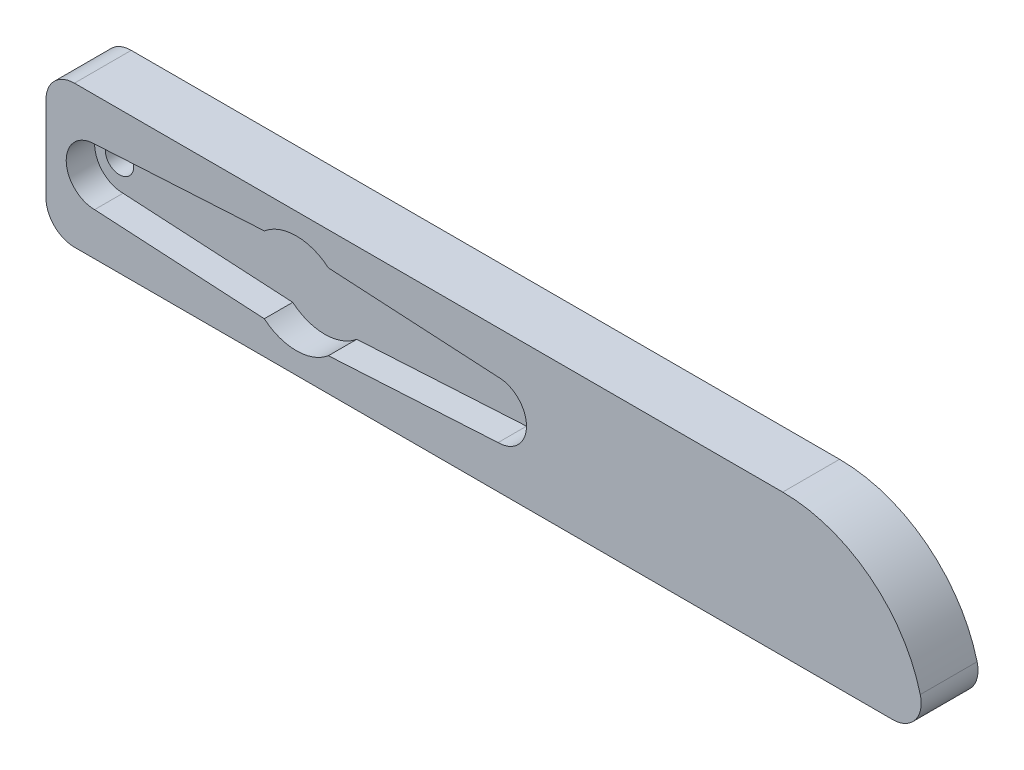
ISO-10303-21;
HEADER;
FILE_DESCRIPTION(('STEP AP214'),'2;1');
FILE_NAME('part.step','',(''),(''),'','','');
FILE_SCHEMA(('AUTOMOTIVE_DESIGN { 1 0 10303 214 1 1 1 1 }'));
ENDSEC;
DATA;
#1=APPLICATION_CONTEXT('core data for automotive mechanical design processes');
#2=APPLICATION_PROTOCOL_DEFINITION('international standard','automotive_design',2000,#1);
#3=PRODUCT_CONTEXT('',#1,'mechanical');
#4=PRODUCT('Part','Part','',(#3));
#5=PRODUCT_RELATED_PRODUCT_CATEGORY('part','',(#4));
#6=PRODUCT_DEFINITION_FORMATION('','',#4);
#7=PRODUCT_DEFINITION_CONTEXT('part definition',#1,'design');
#8=PRODUCT_DEFINITION('design','',#6,#7);
#9=PRODUCT_DEFINITION_SHAPE('','',#8);
#10=(LENGTH_UNIT() NAMED_UNIT(*) SI_UNIT(.MILLI.,.METRE.));
#11=(NAMED_UNIT(*) PLANE_ANGLE_UNIT() SI_UNIT($,.RADIAN.));
#12=(NAMED_UNIT(*) SI_UNIT($,.STERADIAN.) SOLID_ANGLE_UNIT());
#13=UNCERTAINTY_MEASURE_WITH_UNIT(LENGTH_MEASURE(1.E-05),#10,'distance_accuracy_value','');
#14=(GEOMETRIC_REPRESENTATION_CONTEXT(3) GLOBAL_UNCERTAINTY_ASSIGNED_CONTEXT((#13)) GLOBAL_UNIT_ASSIGNED_CONTEXT((#10,
#11,#12)) REPRESENTATION_CONTEXT('',''));
#15=CARTESIAN_POINT('',(0.,0.,0.));
#16=DIRECTION('',(0.,0.,1.));
#17=DIRECTION('',(1.,0.,0.));
#18=AXIS2_PLACEMENT_3D('',#15,#16,#17);
#19=CARTESIAN_POINT('',(-25.,5.,4.));
#20=DIRECTION('',(0.,-1.,0.));
#21=DIRECTION('',(0.,0.,-1.));
#22=AXIS2_PLACEMENT_3D('',#19,#20,#21);
#23=PLANE('',#22);
#24=DIRECTION('',(-1.,0.,0.));
#25=VECTOR('',#24,1.);
#26=CARTESIAN_POINT('',(-25.,5.,0.));
#27=LINE('',#26,#25);
#28=CARTESIAN_POINT('',(34.2351663750844,5.,0.));
#29=VERTEX_POINT('',#28);
#30=CARTESIAN_POINT('',(-15.6215575444172,5.,0.));
#31=VERTEX_POINT('',#30);
#32=EDGE_CURVE('E205',#29,#31,#27,.T.);
#33=ORIENTED_EDGE('',*,*,#32,.T.);
#34=DIRECTION('',(0.,0.,-1.));
#35=VECTOR('',#34,1.);
#36=CARTESIAN_POINT('',(-15.6215575444172,5.,4.));
#37=LINE('',#36,#35);
#38=CARTESIAN_POINT('',(-15.6215575444172,5.,4.));
#39=VERTEX_POINT('',#38);
#40=EDGE_CURVE('E248',#31,#39,#37,.F.);
#41=ORIENTED_EDGE('',*,*,#40,.T.);
#42=DIRECTION('',(-1.,0.,0.));
#43=VECTOR('',#42,1.);
#44=CARTESIAN_POINT('',(-25.,5.,4.));
#45=LINE('',#44,#43);
#46=CARTESIAN_POINT('',(34.2351663750844,5.,4.));
#47=VERTEX_POINT('',#46);
#48=EDGE_CURVE('E217',#47,#39,#45,.T.);
#49=ORIENTED_EDGE('',*,*,#48,.F.);
#50=DIRECTION('',(0.,0.,1.));
#51=VECTOR('',#50,1.);
#52=CARTESIAN_POINT('',(34.2351663750844,5.,0.));
#53=LINE('',#52,#51);
#54=EDGE_CURVE('E228',#47,#29,#53,.F.);
#55=ORIENTED_EDGE('',*,*,#54,.T.);
#56=EDGE_LOOP('',(#33,#41,#49,#55));
#57=FACE_BOUND('',#56,.T.);
#58=ADVANCED_FACE('F33',(#57),#23,.F.);
#59=CARTESIAN_POINT('',(-25.,-5.,4.));
#60=DIRECTION('',(0.,1.,0.));
#61=DIRECTION('',(0.,0.,1.));
#62=AXIS2_PLACEMENT_3D('',#59,#60,#61);
#63=PLANE('',#62);
#64=DIRECTION('',(1.,0.,0.));
#65=VECTOR('',#64,1.);
#66=CARTESIAN_POINT('',(-25.,-5.,4.));
#67=LINE('',#66,#65);
#68=CARTESIAN_POINT('',(-15.6215575444172,-5.,4.));
#69=VERTEX_POINT('',#68);
#70=CARTESIAN_POINT('',(41.9811330674992,-5.,4.));
#71=VERTEX_POINT('',#70);
#72=EDGE_CURVE('E220',#69,#71,#67,.T.);
#73=ORIENTED_EDGE('',*,*,#72,.F.);
#74=DIRECTION('',(0.,0.,1.));
#75=VECTOR('',#74,1.);
#76=CARTESIAN_POINT('',(-15.6215575444172,-5.,4.));
#77=LINE('',#76,#75);
#78=CARTESIAN_POINT('',(-15.6215575444172,-5.,0.));
#79=VERTEX_POINT('',#78);
#80=EDGE_CURVE('E41',#69,#79,#77,.F.);
#81=ORIENTED_EDGE('',*,*,#80,.T.);
#82=DIRECTION('',(1.,0.,0.));
#83=VECTOR('',#82,1.);
#84=CARTESIAN_POINT('',(-25.,-5.,0.));
#85=LINE('',#84,#83);
#86=CARTESIAN_POINT('',(41.9811330674992,-5.,0.));
#87=VERTEX_POINT('',#86);
#88=EDGE_CURVE('E221',#79,#87,#85,.T.);
#89=ORIENTED_EDGE('',*,*,#88,.T.);
#90=DIRECTION('',(0.,0.,1.));
#91=VECTOR('',#90,1.);
#92=CARTESIAN_POINT('',(41.9811330674992,-5.,4.));
#93=LINE('',#92,#91);
#94=EDGE_CURVE('E233',#87,#71,#93,.T.);
#95=ORIENTED_EDGE('',*,*,#94,.T.);
#96=EDGE_LOOP('',(#73,#81,#89,#95));
#97=FACE_BOUND('',#96,.T.);
#98=ADVANCED_FACE('F296',(#97),#63,.F.);
#99=CARTESIAN_POINT('',(0.,0.,4.));
#100=DIRECTION('',(0.,0.,-1.));
#101=DIRECTION('',(-1.,0.,0.));
#102=AXIS2_PLACEMENT_3D('',#99,#100,#101);
#103=PLANE('',#102);
#104=DIRECTION('',(0.998397201135514,0.0565953069147263,0.));
#105=VECTOR('',#104,1.);
#106=CARTESIAN_POINT('',(2.25453013340895,-2.67714285714286,4.));
#107=LINE('',#106,#105);
#108=CARTESIAN_POINT('',(2.25453013340895,-2.67714285714286,4.));
#109=VERTEX_POINT('',#108);
#110=CARTESIAN_POINT('',(14.2,-2.,4.));
#111=VERTEX_POINT('',#110);
#112=EDGE_CURVE('E186',#109,#111,#107,.T.);
#113=ORIENTED_EDGE('',*,*,#112,.F.);
#114=CARTESIAN_POINT('',(0.,0.,4.));
#115=DIRECTION('',(0.,0.,1.));
#116=DIRECTION('',(1.,0.,0.));
#117=AXIS2_PLACEMENT_3D('',#114,#115,#116);
#118=CIRCLE('',#117,3.5);
#119=CARTESIAN_POINT('',(-2.25453013340895,-2.67714285714286,4.));
#120=VERTEX_POINT('',#119);
#121=EDGE_CURVE('E145',#120,#109,#118,.T.);
#122=ORIENTED_EDGE('',*,*,#121,.F.);
#123=DIRECTION('',(0.998397201135514,-0.0565953069147263,0.));
#124=VECTOR('',#123,1.);
#125=CARTESIAN_POINT('',(-2.25453013340895,-2.67714285714286,4.));
#126=LINE('',#125,#124);
#127=CARTESIAN_POINT('',(-14.2,-2.,4.));
#128=VERTEX_POINT('',#127);
#129=EDGE_CURVE('E163',#128,#120,#126,.T.);
#130=ORIENTED_EDGE('',*,*,#129,.F.);
#131=CARTESIAN_POINT('',(-14.2,0.,4.));
#132=DIRECTION('',(0.,0.,1.));
#133=DIRECTION('',(1.,0.,0.));
#134=AXIS2_PLACEMENT_3D('',#131,#132,#133);
#135=CIRCLE('',#134,2.);
#136=CARTESIAN_POINT('',(-14.2,2.,4.));
#137=VERTEX_POINT('',#136);
#138=EDGE_CURVE('E166',#137,#128,#135,.T.);
#139=ORIENTED_EDGE('',*,*,#138,.F.);
#140=DIRECTION('',(-0.998397201135514,-0.0565953069147263,0.));
#141=VECTOR('',#140,1.);
#142=CARTESIAN_POINT('',(-2.25453013340895,2.67714285714286,4.));
#143=LINE('',#142,#141);
#144=CARTESIAN_POINT('',(-2.25453013340895,2.67714285714286,4.));
#145=VERTEX_POINT('',#144);
#146=EDGE_CURVE('E198',#145,#137,#143,.T.);
#147=ORIENTED_EDGE('',*,*,#146,.F.);
#148=CARTESIAN_POINT('',(0.,0.,4.));
#149=DIRECTION('',(0.,0.,1.));
#150=DIRECTION('',(1.,0.,0.));
#151=AXIS2_PLACEMENT_3D('',#148,#149,#150);
#152=CIRCLE('',#151,3.5);
#153=CARTESIAN_POINT('',(2.25453013340895,2.67714285714286,4.));
#154=VERTEX_POINT('',#153);
#155=EDGE_CURVE('E195',#154,#145,#152,.T.);
#156=ORIENTED_EDGE('',*,*,#155,.F.);
#157=DIRECTION('',(-0.998397201135514,0.0565953069147263,0.));
#158=VECTOR('',#157,1.);
#159=CARTESIAN_POINT('',(2.25453013340895,2.67714285714286,4.));
#160=LINE('',#159,#158);
#161=CARTESIAN_POINT('',(14.2,2.,4.));
#162=VERTEX_POINT('',#161);
#163=EDGE_CURVE('E192',#162,#154,#160,.T.);
#164=ORIENTED_EDGE('',*,*,#163,.F.);
#165=CARTESIAN_POINT('',(14.2,0.,4.));
#166=DIRECTION('',(0.,0.,1.));
#167=DIRECTION('',(-1.,0.,0.));
#168=AXIS2_PLACEMENT_3D('',#165,#166,#167);
#169=CIRCLE('',#168,2.);
#170=EDGE_CURVE('E189',#111,#162,#169,.T.);
#171=ORIENTED_EDGE('',*,*,#170,.F.);
#172=EDGE_LOOP('',(#113,#122,#130,#139,#147,#156,#164,#171));
#173=FACE_BOUND('',#172,.T.);
#174=DIRECTION('',(0.,1.,0.));
#175=VECTOR('',#174,1.);
#176=CARTESIAN_POINT('',(-17.6215575444172,7.46074261323311,4.));
#177=LINE('',#176,#175);
#178=CARTESIAN_POINT('',(-17.6215575444172,-3.,4.));
#179=VERTEX_POINT('',#178);
#180=CARTESIAN_POINT('',(-17.6215575444172,3.,4.));
#181=VERTEX_POINT('',#180);
#182=EDGE_CURVE('E260',#179,#181,#177,.T.);
#183=ORIENTED_EDGE('',*,*,#182,.F.);
#184=CARTESIAN_POINT('',(-15.6215575444172,-3.,4.));
#185=DIRECTION('',(0.,0.,-1.));
#186=DIRECTION('',(-1.,0.,0.));
#187=AXIS2_PLACEMENT_3D('',#184,#185,#186);
#188=CIRCLE('',#187,2.);
#189=EDGE_CURVE('E55',#179,#69,#188,.F.);
#190=ORIENTED_EDGE('',*,*,#189,.T.);
#191=ORIENTED_EDGE('',*,*,#72,.T.);
#192=CARTESIAN_POINT('',(41.9811330674992,-3.,4.));
#193=DIRECTION('',(0.,0.,-1.));
#194=DIRECTION('',(-1.,0.,0.));
#195=AXIS2_PLACEMENT_3D('',#192,#193,#194);
#196=CIRCLE('',#195,2.);
#197=CARTESIAN_POINT('',(43.9176247406029,-2.5,4.));
#198=VERTEX_POINT('',#197);
#199=EDGE_CURVE('E236',#71,#198,#196,.F.);
#200=ORIENTED_EDGE('',*,*,#199,.T.);
#201=CARTESIAN_POINT('',(34.2351663750844,-5.,4.));
#202=DIRECTION('',(0.,0.,-1.));
#203=DIRECTION('',(-1.,0.,0.));
#204=AXIS2_PLACEMENT_3D('',#201,#202,#203);
#205=CIRCLE('',#204,10.);
#206=EDGE_CURVE('E223',#198,#47,#205,.F.);
#207=ORIENTED_EDGE('',*,*,#206,.T.);
#208=ORIENTED_EDGE('',*,*,#48,.T.);
#209=CARTESIAN_POINT('',(-15.6215575444172,3.,4.));
#210=DIRECTION('',(0.,0.,-1.));
#211=DIRECTION('',(-1.,0.,0.));
#212=AXIS2_PLACEMENT_3D('',#209,#210,#211);
#213=CIRCLE('',#212,2.);
#214=EDGE_CURVE('E250',#39,#181,#213,.F.);
#215=ORIENTED_EDGE('',*,*,#214,.T.);
#216=EDGE_LOOP('',(#183,#190,#191,#200,#207,#208,#215));
#217=FACE_BOUND('',#216,.T.);
#218=ADVANCED_FACE('F264',(#173,#217),#103,.F.);
#219=CARTESIAN_POINT('',(0.,0.,0.));
#220=DIRECTION('',(0.,0.,-1.));
#221=DIRECTION('',(-1.,0.,0.));
#222=AXIS2_PLACEMENT_3D('',#219,#220,#221);
#223=PLANE('',#222);
#224=ORIENTED_EDGE('',*,*,#88,.F.);
#225=CARTESIAN_POINT('',(-15.6215575444172,-3.,0.));
#226=DIRECTION('',(0.,0.,-1.));
#227=DIRECTION('',(-1.,0.,0.));
#228=AXIS2_PLACEMENT_3D('',#225,#226,#227);
#229=CIRCLE('',#228,2.);
#230=CARTESIAN_POINT('',(-17.6215575444172,-3.,0.));
#231=VERTEX_POINT('',#230);
#232=EDGE_CURVE('E11',#79,#231,#229,.T.);
#233=ORIENTED_EDGE('',*,*,#232,.T.);
#234=DIRECTION('',(0.,1.,0.));
#235=VECTOR('',#234,1.);
#236=CARTESIAN_POINT('',(-17.6215575444172,7.46074261323311,0.));
#237=LINE('',#236,#235);
#238=CARTESIAN_POINT('',(-17.6215575444172,3.,0.));
#239=VERTEX_POINT('',#238);
#240=EDGE_CURVE('E261',#231,#239,#237,.T.);
#241=ORIENTED_EDGE('',*,*,#240,.T.);
#242=CARTESIAN_POINT('',(-15.6215575444172,3.,0.));
#243=DIRECTION('',(0.,0.,-1.));
#244=DIRECTION('',(-1.,0.,0.));
#245=AXIS2_PLACEMENT_3D('',#242,#243,#244);
#246=CIRCLE('',#245,2.);
#247=EDGE_CURVE('E246',#239,#31,#246,.T.);
#248=ORIENTED_EDGE('',*,*,#247,.T.);
#249=ORIENTED_EDGE('',*,*,#32,.F.);
#250=CARTESIAN_POINT('',(34.2351663750844,-5.,0.));
#251=DIRECTION('',(0.,0.,-1.));
#252=DIRECTION('',(-1.,0.,0.));
#253=AXIS2_PLACEMENT_3D('',#250,#251,#252);
#254=CIRCLE('',#253,10.);
#255=CARTESIAN_POINT('',(43.9176247406029,-2.5,0.));
#256=VERTEX_POINT('',#255);
#257=EDGE_CURVE('E230',#29,#256,#254,.T.);
#258=ORIENTED_EDGE('',*,*,#257,.T.);
#259=CARTESIAN_POINT('',(41.9811330674992,-3.,0.));
#260=DIRECTION('',(0.,0.,-1.));
#261=DIRECTION('',(-1.,0.,0.));
#262=AXIS2_PLACEMENT_3D('',#259,#260,#261);
#263=CIRCLE('',#262,2.);
#264=EDGE_CURVE('E240',#256,#87,#263,.T.);
#265=ORIENTED_EDGE('',*,*,#264,.T.);
#266=EDGE_LOOP('',(#224,#233,#241,#248,#249,#258,#265));
#267=FACE_BOUND('',#266,.T.);
#268=CARTESIAN_POINT('',(-14.45,0.,0.));
#269=DIRECTION('',(0.,0.,-1.));
#270=DIRECTION('',(-1.,0.,0.));
#271=AXIS2_PLACEMENT_3D('',#268,#269,#270);
#272=CIRCLE('',#271,1.);
#273=CARTESIAN_POINT('',(-15.45,0.,0.));
#274=VERTEX_POINT('',#273);
#275=EDGE_CURVE('E272',#274,#274,#272,.F.);
#276=ORIENTED_EDGE('',*,*,#275,.T.);
#277=EDGE_LOOP('',(#276));
#278=FACE_BOUND('',#277,.T.);
#279=CARTESIAN_POINT('',(14.45,0.,0.));
#280=DIRECTION('',(0.,0.,-1.));
#281=DIRECTION('',(-1.,0.,0.));
#282=AXIS2_PLACEMENT_3D('',#279,#280,#281);
#283=CIRCLE('',#282,1.);
#284=CARTESIAN_POINT('',(13.45,0.,0.));
#285=VERTEX_POINT('',#284);
#286=EDGE_CURVE('E169',#285,#285,#283,.F.);
#287=ORIENTED_EDGE('',*,*,#286,.T.);
#288=EDGE_LOOP('',(#287));
#289=FACE_BOUND('',#288,.T.);
#290=ADVANCED_FACE('F281',(#267,#278,#289),#223,.T.);
#291=CARTESIAN_POINT('',(0.,0.,2.));
#292=DIRECTION('',(0.,0.,1.));
#293=DIRECTION('',(1.,0.,0.));
#294=AXIS2_PLACEMENT_3D('',#291,#292,#293);
#295=CYLINDRICAL_SURFACE('',#294,3.5);
#296=ORIENTED_EDGE('',*,*,#121,.T.);
#297=DIRECTION('',(0.,0.,1.));
#298=VECTOR('',#297,1.);
#299=CARTESIAN_POINT('',(2.25453013340895,-2.67714285714286,2.));
#300=LINE('',#299,#298);
#301=CARTESIAN_POINT('',(2.25453013340895,-2.67714285714286,2.));
#302=VERTEX_POINT('',#301);
#303=EDGE_CURVE('E138',#302,#109,#300,.T.);
#304=ORIENTED_EDGE('',*,*,#303,.F.);
#305=CARTESIAN_POINT('',(0.,0.,2.));
#306=DIRECTION('',(0.,0.,1.));
#307=DIRECTION('',(1.,0.,0.));
#308=AXIS2_PLACEMENT_3D('',#305,#306,#307);
#309=CIRCLE('',#308,3.5);
#310=CARTESIAN_POINT('',(-2.25453013340895,-2.67714285714286,2.));
#311=VERTEX_POINT('',#310);
#312=EDGE_CURVE('E142',#311,#302,#309,.T.);
#313=ORIENTED_EDGE('',*,*,#312,.F.);
#314=DIRECTION('',(0.,0.,1.));
#315=VECTOR('',#314,1.);
#316=CARTESIAN_POINT('',(-2.25453013340895,-2.67714285714286,2.));
#317=LINE('',#316,#315);
#318=EDGE_CURVE('E203',#311,#120,#317,.T.);
#319=ORIENTED_EDGE('',*,*,#318,.T.);
#320=EDGE_LOOP('',(#296,#304,#313,#319));
#321=FACE_BOUND('',#320,.T.);
#322=ADVANCED_FACE('F140',(#321),#295,.F.);
#323=CARTESIAN_POINT('',(-2.25453013340895,-2.67714285714286,2.));
#324=DIRECTION('',(-0.0565953069147263,-0.998397201135514,0.));
#325=DIRECTION('',(0.998397201135514,-0.0565953069147263,0.));
#326=AXIS2_PLACEMENT_3D('',#323,#324,#325);
#327=PLANE('',#326);
#328=ORIENTED_EDGE('',*,*,#129,.T.);
#329=ORIENTED_EDGE('',*,*,#318,.F.);
#330=DIRECTION('',(0.998397201135514,-0.0565953069147263,0.));
#331=VECTOR('',#330,1.);
#332=CARTESIAN_POINT('',(-2.25453013340895,-2.67714285714286,2.));
#333=LINE('',#332,#331);
#334=CARTESIAN_POINT('',(-14.2,-2.,2.));
#335=VERTEX_POINT('',#334);
#336=EDGE_CURVE('E150',#335,#311,#333,.T.);
#337=ORIENTED_EDGE('',*,*,#336,.F.);
#338=DIRECTION('',(0.,0.,1.));
#339=VECTOR('',#338,1.);
#340=CARTESIAN_POINT('',(-14.2,-2.,2.));
#341=LINE('',#340,#339);
#342=EDGE_CURVE('E206',#335,#128,#341,.T.);
#343=ORIENTED_EDGE('',*,*,#342,.T.);
#344=EDGE_LOOP('',(#328,#329,#337,#343));
#345=FACE_BOUND('',#344,.T.);
#346=ADVANCED_FACE('F340',(#345),#327,.F.);
#347=CARTESIAN_POINT('',(-14.2,0.,2.));
#348=DIRECTION('',(0.,0.,1.));
#349=DIRECTION('',(1.,0.,0.));
#350=AXIS2_PLACEMENT_3D('',#347,#348,#349);
#351=CYLINDRICAL_SURFACE('',#350,2.);
#352=ORIENTED_EDGE('',*,*,#138,.T.);
#353=ORIENTED_EDGE('',*,*,#342,.F.);
#354=CARTESIAN_POINT('',(-14.2,0.,2.));
#355=DIRECTION('',(0.,0.,1.));
#356=DIRECTION('',(1.,0.,0.));
#357=AXIS2_PLACEMENT_3D('',#354,#355,#356);
#358=CIRCLE('',#357,2.);
#359=CARTESIAN_POINT('',(-14.2,2.,2.));
#360=VERTEX_POINT('',#359);
#361=EDGE_CURVE('E182',#360,#335,#358,.T.);
#362=ORIENTED_EDGE('',*,*,#361,.F.);
#363=DIRECTION('',(0.,0.,1.));
#364=VECTOR('',#363,1.);
#365=CARTESIAN_POINT('',(-14.2,2.,2.));
#366=LINE('',#365,#364);
#367=EDGE_CURVE('E208',#360,#137,#366,.T.);
#368=ORIENTED_EDGE('',*,*,#367,.T.);
#369=EDGE_LOOP('',(#352,#353,#362,#368));
#370=FACE_BOUND('',#369,.T.);
#371=ADVANCED_FACE('F362',(#370),#351,.F.);
#372=CARTESIAN_POINT('',(-2.25453013340895,2.67714285714286,2.));
#373=DIRECTION('',(-0.0565953069147263,0.998397201135514,0.));
#374=DIRECTION('',(-0.998397201135514,-0.0565953069147263,0.));
#375=AXIS2_PLACEMENT_3D('',#372,#373,#374);
#376=PLANE('',#375);
#377=ORIENTED_EDGE('',*,*,#146,.T.);
#378=ORIENTED_EDGE('',*,*,#367,.F.);
#379=DIRECTION('',(-0.998397201135514,-0.0565953069147263,0.));
#380=VECTOR('',#379,1.);
#381=CARTESIAN_POINT('',(-2.25453013340895,2.67714285714286,2.));
#382=LINE('',#381,#380);
#383=CARTESIAN_POINT('',(-2.25453013340895,2.67714285714286,2.));
#384=VERTEX_POINT('',#383);
#385=EDGE_CURVE('E179',#384,#360,#382,.T.);
#386=ORIENTED_EDGE('',*,*,#385,.F.);
#387=DIRECTION('',(0.,0.,1.));
#388=VECTOR('',#387,1.);
#389=CARTESIAN_POINT('',(-2.25453013340895,2.67714285714286,2.));
#390=LINE('',#389,#388);
#391=EDGE_CURVE('E210',#384,#145,#390,.T.);
#392=ORIENTED_EDGE('',*,*,#391,.T.);
#393=EDGE_LOOP('',(#377,#378,#386,#392));
#394=FACE_BOUND('',#393,.T.);
#395=ADVANCED_FACE('F358',(#394),#376,.F.);
#396=CARTESIAN_POINT('',(0.,0.,2.));
#397=DIRECTION('',(0.,0.,1.));
#398=DIRECTION('',(1.,0.,0.));
#399=AXIS2_PLACEMENT_3D('',#396,#397,#398);
#400=CYLINDRICAL_SURFACE('',#399,3.5);
#401=ORIENTED_EDGE('',*,*,#155,.T.);
#402=ORIENTED_EDGE('',*,*,#391,.F.);
#403=CARTESIAN_POINT('',(0.,0.,2.));
#404=DIRECTION('',(0.,0.,1.));
#405=DIRECTION('',(1.,0.,0.));
#406=AXIS2_PLACEMENT_3D('',#403,#404,#405);
#407=CIRCLE('',#406,3.5);
#408=CARTESIAN_POINT('',(2.25453013340895,2.67714285714286,2.));
#409=VERTEX_POINT('',#408);
#410=EDGE_CURVE('E176',#409,#384,#407,.T.);
#411=ORIENTED_EDGE('',*,*,#410,.F.);
#412=DIRECTION('',(0.,0.,1.));
#413=VECTOR('',#412,1.);
#414=CARTESIAN_POINT('',(2.25453013340895,2.67714285714286,2.));
#415=LINE('',#414,#413);
#416=EDGE_CURVE('E212',#409,#154,#415,.T.);
#417=ORIENTED_EDGE('',*,*,#416,.T.);
#418=EDGE_LOOP('',(#401,#402,#411,#417));
#419=FACE_BOUND('',#418,.T.);
#420=ADVANCED_FACE('F354',(#419),#400,.F.);
#421=CARTESIAN_POINT('',(2.25453013340895,2.67714285714286,2.));
#422=DIRECTION('',(0.0565953069147263,0.998397201135514,0.));
#423=DIRECTION('',(-0.998397201135514,0.0565953069147263,0.));
#424=AXIS2_PLACEMENT_3D('',#421,#422,#423);
#425=PLANE('',#424);
#426=ORIENTED_EDGE('',*,*,#163,.T.);
#427=ORIENTED_EDGE('',*,*,#416,.F.);
#428=DIRECTION('',(-0.998397201135514,0.0565953069147263,0.));
#429=VECTOR('',#428,1.);
#430=CARTESIAN_POINT('',(2.25453013340895,2.67714285714286,2.));
#431=LINE('',#430,#429);
#432=CARTESIAN_POINT('',(14.2,2.,2.));
#433=VERTEX_POINT('',#432);
#434=EDGE_CURVE('E173',#433,#409,#431,.T.);
#435=ORIENTED_EDGE('',*,*,#434,.F.);
#436=DIRECTION('',(0.,0.,1.));
#437=VECTOR('',#436,1.);
#438=CARTESIAN_POINT('',(14.2,2.,2.));
#439=LINE('',#438,#437);
#440=EDGE_CURVE('E214',#433,#162,#439,.T.);
#441=ORIENTED_EDGE('',*,*,#440,.T.);
#442=EDGE_LOOP('',(#426,#427,#435,#441));
#443=FACE_BOUND('',#442,.T.);
#444=ADVANCED_FACE('F350',(#443),#425,.F.);
#445=CARTESIAN_POINT('',(14.2,0.,2.));
#446=DIRECTION('',(0.,0.,1.));
#447=DIRECTION('',(1.,0.,0.));
#448=AXIS2_PLACEMENT_3D('',#445,#446,#447);
#449=CYLINDRICAL_SURFACE('',#448,2.);
#450=ORIENTED_EDGE('',*,*,#170,.T.);
#451=ORIENTED_EDGE('',*,*,#440,.F.);
#452=CARTESIAN_POINT('',(14.2,0.,2.));
#453=DIRECTION('',(0.,0.,1.));
#454=DIRECTION('',(-1.,0.,0.));
#455=AXIS2_PLACEMENT_3D('',#452,#453,#454);
#456=CIRCLE('',#455,2.);
#457=CARTESIAN_POINT('',(14.2,-2.,2.));
#458=VERTEX_POINT('',#457);
#459=EDGE_CURVE('E158',#458,#433,#456,.T.);
#460=ORIENTED_EDGE('',*,*,#459,.F.);
#461=DIRECTION('',(0.,0.,1.));
#462=VECTOR('',#461,1.);
#463=CARTESIAN_POINT('',(14.2,-2.,2.));
#464=LINE('',#463,#462);
#465=EDGE_CURVE('E149',#458,#111,#464,.T.);
#466=ORIENTED_EDGE('',*,*,#465,.T.);
#467=EDGE_LOOP('',(#450,#451,#460,#466));
#468=FACE_BOUND('',#467,.T.);
#469=ADVANCED_FACE('F347',(#468),#449,.F.);
#470=CARTESIAN_POINT('',(2.25453013340895,-2.67714285714286,2.));
#471=DIRECTION('',(0.0565953069147263,-0.998397201135514,0.));
#472=DIRECTION('',(0.998397201135514,0.0565953069147263,0.));
#473=AXIS2_PLACEMENT_3D('',#470,#471,#472);
#474=PLANE('',#473);
#475=ORIENTED_EDGE('',*,*,#112,.T.);
#476=ORIENTED_EDGE('',*,*,#465,.F.);
#477=DIRECTION('',(0.998397201135514,0.0565953069147263,0.));
#478=VECTOR('',#477,1.);
#479=CARTESIAN_POINT('',(2.25453013340895,-2.67714285714286,2.));
#480=LINE('',#479,#478);
#481=EDGE_CURVE('E153',#302,#458,#480,.T.);
#482=ORIENTED_EDGE('',*,*,#481,.F.);
#483=ORIENTED_EDGE('',*,*,#303,.T.);
#484=EDGE_LOOP('',(#475,#476,#482,#483));
#485=FACE_BOUND('',#484,.T.);
#486=ADVANCED_FACE('F154',(#485),#474,.F.);
#487=CARTESIAN_POINT('',(0.,0.,2.));
#488=DIRECTION('',(0.,0.,1.));
#489=DIRECTION('',(1.,0.,0.));
#490=AXIS2_PLACEMENT_3D('',#487,#488,#489);
#491=PLANE('',#490);
#492=CARTESIAN_POINT('',(-14.45,0.,2.));
#493=DIRECTION('',(0.,0.,1.));
#494=DIRECTION('',(1.,0.,0.));
#495=AXIS2_PLACEMENT_3D('',#492,#493,#494);
#496=CIRCLE('',#495,1.);
#497=CARTESIAN_POINT('',(-13.45,0.,2.));
#498=VERTEX_POINT('',#497);
#499=EDGE_CURVE('E187',#498,#498,#496,.T.);
#500=ORIENTED_EDGE('',*,*,#499,.F.);
#501=EDGE_LOOP('',(#500));
#502=FACE_BOUND('',#501,.T.);
#503=CARTESIAN_POINT('',(14.45,0.,2.));
#504=DIRECTION('',(0.,0.,1.));
#505=DIRECTION('',(-1.,0.,0.));
#506=AXIS2_PLACEMENT_3D('',#503,#504,#505);
#507=CIRCLE('',#506,1.);
#508=CARTESIAN_POINT('',(13.45,0.,2.));
#509=VERTEX_POINT('',#508);
#510=EDGE_CURVE('E274',#509,#509,#507,.T.);
#511=ORIENTED_EDGE('',*,*,#510,.F.);
#512=EDGE_LOOP('',(#511));
#513=FACE_BOUND('',#512,.T.);
#514=ORIENTED_EDGE('',*,*,#312,.T.);
#515=ORIENTED_EDGE('',*,*,#481,.T.);
#516=ORIENTED_EDGE('',*,*,#459,.T.);
#517=ORIENTED_EDGE('',*,*,#434,.T.);
#518=ORIENTED_EDGE('',*,*,#410,.T.);
#519=ORIENTED_EDGE('',*,*,#385,.T.);
#520=ORIENTED_EDGE('',*,*,#361,.T.);
#521=ORIENTED_EDGE('',*,*,#336,.T.);
#522=EDGE_LOOP('',(#514,#515,#516,#517,#518,#519,#520,#521));
#523=FACE_BOUND('',#522,.T.);
#524=ADVANCED_FACE('F160',(#502,#513,#523),#491,.T.);
#525=CARTESIAN_POINT('',(14.45,0.,-0.00100000000000013));
#526=DIRECTION('',(0.,0.,1.));
#527=DIRECTION('',(1.,0.,0.));
#528=AXIS2_PLACEMENT_3D('',#525,#526,#527);
#529=CYLINDRICAL_SURFACE('',#528,1.);
#530=ORIENTED_EDGE('',*,*,#286,.F.);
#531=EDGE_LOOP('',(#530));
#532=FACE_BOUND('',#531,.T.);
#533=ORIENTED_EDGE('',*,*,#510,.T.);
#534=EDGE_LOOP('',(#533));
#535=FACE_BOUND('',#534,.T.);
#536=ADVANCED_FACE('F283',(#532,#535),#529,.F.);
#537=CARTESIAN_POINT('',(-14.45,0.,-0.00100000000000013));
#538=DIRECTION('',(0.,0.,1.));
#539=DIRECTION('',(1.,0.,0.));
#540=AXIS2_PLACEMENT_3D('',#537,#538,#539);
#541=CYLINDRICAL_SURFACE('',#540,1.);
#542=ORIENTED_EDGE('',*,*,#275,.F.);
#543=EDGE_LOOP('',(#542));
#544=FACE_BOUND('',#543,.T.);
#545=ORIENTED_EDGE('',*,*,#499,.T.);
#546=EDGE_LOOP('',(#545));
#547=FACE_BOUND('',#546,.T.);
#548=ADVANCED_FACE('F285',(#544,#547),#541,.F.);
#549=CARTESIAN_POINT('',(-17.6215575444172,7.46074261323311,-0.00100000000000013));
#550=DIRECTION('',(1.,0.,0.));
#551=DIRECTION('',(0.,0.,-1.));
#552=AXIS2_PLACEMENT_3D('',#549,#550,#551);
#553=PLANE('',#552);
#554=ORIENTED_EDGE('',*,*,#240,.F.);
#555=DIRECTION('',(0.,0.,1.));
#556=VECTOR('',#555,1.);
#557=CARTESIAN_POINT('',(-17.6215575444172,-3.,-0.00100000000000013));
#558=LINE('',#557,#556);
#559=EDGE_CURVE('E253',#231,#179,#558,.T.);
#560=ORIENTED_EDGE('',*,*,#559,.T.);
#561=ORIENTED_EDGE('',*,*,#182,.T.);
#562=DIRECTION('',(0.,0.,-1.));
#563=VECTOR('',#562,1.);
#564=CARTESIAN_POINT('',(-17.6215575444172,3.,-0.00100000000000013));
#565=LINE('',#564,#563);
#566=EDGE_CURVE('E243',#181,#239,#565,.T.);
#567=ORIENTED_EDGE('',*,*,#566,.T.);
#568=EDGE_LOOP('',(#554,#560,#561,#567));
#569=FACE_BOUND('',#568,.T.);
#570=ADVANCED_FACE('F259',(#569),#553,.F.);
#571=CARTESIAN_POINT('',(34.2351663750844,-5.,0.));
#572=DIRECTION('',(0.,0.,-1.));
#573=DIRECTION('',(-1.,0.,0.));
#574=AXIS2_PLACEMENT_3D('',#571,#572,#573);
#575=CYLINDRICAL_SURFACE('',#574,10.);
#576=ORIENTED_EDGE('',*,*,#206,.F.);
#577=DIRECTION('',(0.,0.,-1.));
#578=VECTOR('',#577,1.);
#579=CARTESIAN_POINT('',(43.9176247406029,-2.5,0.));
#580=LINE('',#579,#578);
#581=EDGE_CURVE('E238',#198,#256,#580,.T.);
#582=ORIENTED_EDGE('',*,*,#581,.T.);
#583=ORIENTED_EDGE('',*,*,#257,.F.);
#584=ORIENTED_EDGE('',*,*,#54,.F.);
#585=EDGE_LOOP('',(#576,#582,#583,#584));
#586=FACE_BOUND('',#585,.T.);
#587=ADVANCED_FACE('F305',(#586),#575,.T.);
#588=CARTESIAN_POINT('',(41.9811330674992,-3.,0.));
#589=DIRECTION('',(0.,0.,-1.));
#590=DIRECTION('',(-1.,0.,0.));
#591=AXIS2_PLACEMENT_3D('',#588,#589,#590);
#592=CYLINDRICAL_SURFACE('',#591,2.);
#593=ORIENTED_EDGE('',*,*,#264,.F.);
#594=ORIENTED_EDGE('',*,*,#581,.F.);
#595=ORIENTED_EDGE('',*,*,#199,.F.);
#596=ORIENTED_EDGE('',*,*,#94,.F.);
#597=EDGE_LOOP('',(#593,#594,#595,#596));
#598=FACE_BOUND('',#597,.T.);
#599=ADVANCED_FACE('F308',(#598),#592,.T.);
#600=CARTESIAN_POINT('',(-15.6215575444172,3.,-0.00100000000000013));
#601=DIRECTION('',(0.,0.,-1.));
#602=DIRECTION('',(-1.,0.,0.));
#603=AXIS2_PLACEMENT_3D('',#600,#601,#602);
#604=CYLINDRICAL_SURFACE('',#603,2.);
#605=ORIENTED_EDGE('',*,*,#214,.F.);
#606=ORIENTED_EDGE('',*,*,#40,.F.);
#607=ORIENTED_EDGE('',*,*,#247,.F.);
#608=ORIENTED_EDGE('',*,*,#566,.F.);
#609=EDGE_LOOP('',(#605,#606,#607,#608));
#610=FACE_BOUND('',#609,.T.);
#611=ADVANCED_FACE('F311',(#610),#604,.T.);
#612=CARTESIAN_POINT('',(-15.6215575444172,-3.,-0.00100000000000013));
#613=DIRECTION('',(0.,0.,1.));
#614=DIRECTION('',(1.,0.,0.));
#615=AXIS2_PLACEMENT_3D('',#612,#613,#614);
#616=CYLINDRICAL_SURFACE('',#615,2.);
#617=ORIENTED_EDGE('',*,*,#232,.F.);
#618=ORIENTED_EDGE('',*,*,#80,.F.);
#619=ORIENTED_EDGE('',*,*,#189,.F.);
#620=ORIENTED_EDGE('',*,*,#559,.F.);
#621=EDGE_LOOP('',(#617,#618,#619,#620));
#622=FACE_BOUND('',#621,.T.);
#623=ADVANCED_FACE('F35',(#622),#616,.T.);
#624=CLOSED_SHELL('',(#58,#98,#218,#290,#322,#346,#371,#395,#420,#444,#469,#486,#524,#536,#548,
#570,#587,#599,#611,#623));
#625=MANIFOLD_SOLID_BREP('B2',#624);
#626=ADVANCED_BREP_SHAPE_REPRESENTATION('',(#18,#625),#14);
#627=SHAPE_DEFINITION_REPRESENTATION(#9,#626);
ENDSEC;
END-ISO-10303-21;
